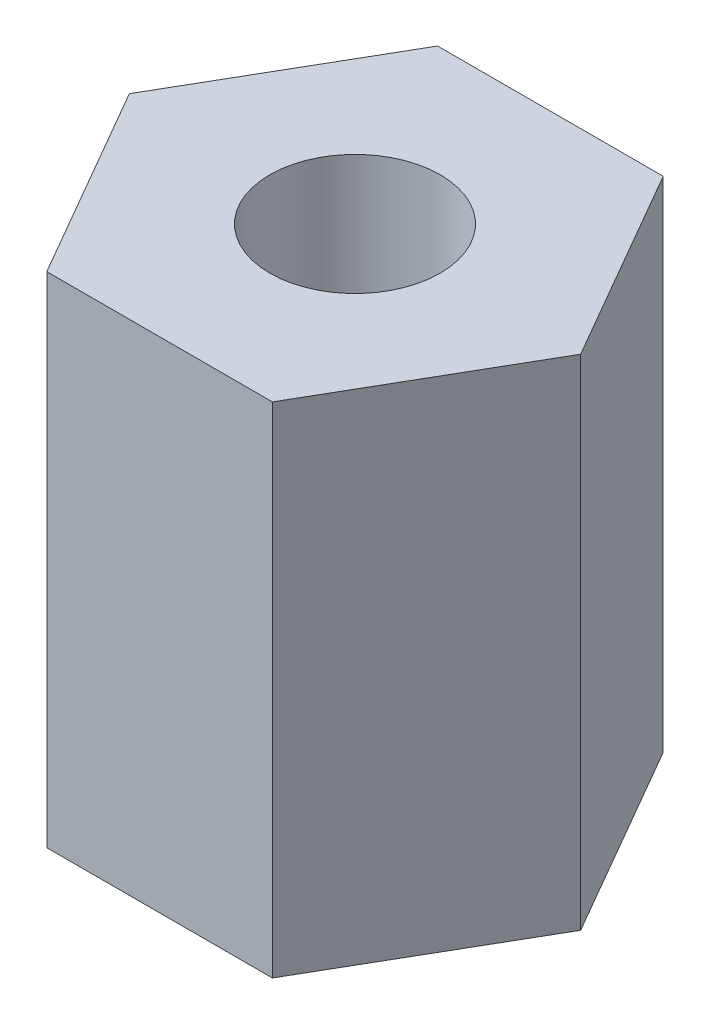
ISO-10303-21;
HEADER;
FILE_DESCRIPTION(('STEP AP214'),'2;1');
FILE_NAME('part.step','',(''),(''),'','','');
FILE_SCHEMA(('AUTOMOTIVE_DESIGN { 1 0 10303 214 1 1 1 1 }'));
ENDSEC;
DATA;
#1=APPLICATION_CONTEXT('core data for automotive mechanical design processes');
#2=APPLICATION_PROTOCOL_DEFINITION('international standard','automotive_design',2000,#1);
#3=PRODUCT_CONTEXT('',#1,'mechanical');
#4=PRODUCT('Part','Part','',(#3));
#5=PRODUCT_RELATED_PRODUCT_CATEGORY('part','',(#4));
#6=PRODUCT_DEFINITION_FORMATION('','',#4);
#7=PRODUCT_DEFINITION_CONTEXT('part definition',#1,'design');
#8=PRODUCT_DEFINITION('design','',#6,#7);
#9=PRODUCT_DEFINITION_SHAPE('','',#8);
#10=(LENGTH_UNIT() NAMED_UNIT(*) SI_UNIT(.MILLI.,.METRE.));
#11=(NAMED_UNIT(*) PLANE_ANGLE_UNIT() SI_UNIT($,.RADIAN.));
#12=(NAMED_UNIT(*) SI_UNIT($,.STERADIAN.) SOLID_ANGLE_UNIT());
#13=UNCERTAINTY_MEASURE_WITH_UNIT(LENGTH_MEASURE(1.E-05),#10,'distance_accuracy_value','');
#14=(GEOMETRIC_REPRESENTATION_CONTEXT(3) GLOBAL_UNCERTAINTY_ASSIGNED_CONTEXT((#13)) GLOBAL_UNIT_ASSIGNED_CONTEXT((#10,
#11,#12)) REPRESENTATION_CONTEXT('',''));
#15=CARTESIAN_POINT('',(0.,0.,0.));
#16=DIRECTION('',(0.,0.,1.));
#17=DIRECTION('',(1.,0.,0.));
#18=AXIS2_PLACEMENT_3D('',#15,#16,#17);
#19=CARTESIAN_POINT('',(-1.35677313259562,0.,2.35));
#20=DIRECTION('',(0.,0.,1.));
#21=DIRECTION('',(1.,0.,0.));
#22=AXIS2_PLACEMENT_3D('',#19,#20,#21);
#23=PLANE('',#22);
#24=DIRECTION('',(1.,0.,0.));
#25=VECTOR('',#24,1.);
#26=CARTESIAN_POINT('',(-1.35677313259562,6.,2.35));
#27=LINE('',#26,#25);
#28=CARTESIAN_POINT('',(-1.35677313259562,6.,2.35));
#29=VERTEX_POINT('',#28);
#30=CARTESIAN_POINT('',(1.35677313259562,6.,2.35));
#31=VERTEX_POINT('',#30);
#32=EDGE_CURVE('E118',#29,#31,#27,.T.);
#33=ORIENTED_EDGE('',*,*,#32,.F.);
#34=DIRECTION('',(0.,1.,0.));
#35=VECTOR('',#34,1.);
#36=CARTESIAN_POINT('',(-1.35677313259562,0.,2.35));
#37=LINE('',#36,#35);
#38=CARTESIAN_POINT('',(-1.35677313259562,0.,2.35));
#39=VERTEX_POINT('',#38);
#40=EDGE_CURVE('E11',#39,#29,#37,.T.);
#41=ORIENTED_EDGE('',*,*,#40,.F.);
#42=DIRECTION('',(1.,0.,0.));
#43=VECTOR('',#42,1.);
#44=CARTESIAN_POINT('',(-1.35677313259562,0.,2.35));
#45=LINE('',#44,#43);
#46=CARTESIAN_POINT('',(1.35677313259562,0.,2.35));
#47=VERTEX_POINT('',#46);
#48=EDGE_CURVE('E133',#39,#47,#45,.T.);
#49=ORIENTED_EDGE('',*,*,#48,.T.);
#50=DIRECTION('',(0.,1.,0.));
#51=VECTOR('',#50,1.);
#52=CARTESIAN_POINT('',(1.35677313259562,0.,2.35));
#53=LINE('',#52,#51);
#54=EDGE_CURVE('E36',#47,#31,#53,.T.);
#55=ORIENTED_EDGE('',*,*,#54,.T.);
#56=EDGE_LOOP('',(#33,#41,#49,#55));
#57=FACE_BOUND('',#56,.T.);
#58=ADVANCED_FACE('F33',(#57),#23,.T.);
#59=CARTESIAN_POINT('',(-2.71354626519124,0.,0.));
#60=DIRECTION('',(-0.866025403784439,0.,0.5));
#61=DIRECTION('',(0.5,0.,0.866025403784439));
#62=AXIS2_PLACEMENT_3D('',#59,#60,#61);
#63=PLANE('',#62);
#64=DIRECTION('',(0.5,0.,0.866025403784438));
#65=VECTOR('',#64,1.);
#66=CARTESIAN_POINT('',(-2.71354626519124,6.,0.));
#67=LINE('',#66,#65);
#68=CARTESIAN_POINT('',(-2.71354626519124,6.,0.));
#69=VERTEX_POINT('',#68);
#70=EDGE_CURVE('E131',#69,#29,#67,.T.);
#71=ORIENTED_EDGE('',*,*,#70,.F.);
#72=DIRECTION('',(0.,1.,0.));
#73=VECTOR('',#72,1.);
#74=CARTESIAN_POINT('',(-2.71354626519124,0.,0.));
#75=LINE('',#74,#73);
#76=CARTESIAN_POINT('',(-2.71354626519124,0.,0.));
#77=VERTEX_POINT('',#76);
#78=EDGE_CURVE('E42',#77,#69,#75,.T.);
#79=ORIENTED_EDGE('',*,*,#78,.F.);
#80=DIRECTION('',(0.5,0.,0.866025403784438));
#81=VECTOR('',#80,1.);
#82=CARTESIAN_POINT('',(-2.71354626519124,0.,0.));
#83=LINE('',#82,#81);
#84=EDGE_CURVE('E108',#77,#39,#83,.T.);
#85=ORIENTED_EDGE('',*,*,#84,.T.);
#86=ORIENTED_EDGE('',*,*,#40,.T.);
#87=EDGE_LOOP('',(#71,#79,#85,#86));
#88=FACE_BOUND('',#87,.T.);
#89=ADVANCED_FACE('F141',(#88),#63,.T.);
#90=CARTESIAN_POINT('',(-1.35677313259562,0.,-2.35));
#91=DIRECTION('',(-0.866025403784438,0.,-0.500000000000001));
#92=DIRECTION('',(-0.500000000000001,0.,0.866025403784438));
#93=AXIS2_PLACEMENT_3D('',#90,#91,#92);
#94=PLANE('',#93);
#95=DIRECTION('',(-0.5,0.,0.866025403784438));
#96=VECTOR('',#95,1.);
#97=CARTESIAN_POINT('',(-1.35677313259562,6.,-2.35));
#98=LINE('',#97,#96);
#99=CARTESIAN_POINT('',(-1.35677313259562,6.,-2.35));
#100=VERTEX_POINT('',#99);
#101=EDGE_CURVE('E95',#100,#69,#98,.T.);
#102=ORIENTED_EDGE('',*,*,#101,.F.);
#103=DIRECTION('',(0.,1.,0.));
#104=VECTOR('',#103,1.);
#105=CARTESIAN_POINT('',(-1.35677313259562,0.,-2.35));
#106=LINE('',#105,#104);
#107=CARTESIAN_POINT('',(-1.35677313259562,0.,-2.35));
#108=VERTEX_POINT('',#107);
#109=EDGE_CURVE('E90',#108,#100,#106,.T.);
#110=ORIENTED_EDGE('',*,*,#109,.F.);
#111=DIRECTION('',(-0.5,0.,0.866025403784438));
#112=VECTOR('',#111,1.);
#113=CARTESIAN_POINT('',(-1.35677313259562,0.,-2.35));
#114=LINE('',#113,#112);
#115=EDGE_CURVE('E93',#108,#77,#114,.T.);
#116=ORIENTED_EDGE('',*,*,#115,.T.);
#117=ORIENTED_EDGE('',*,*,#78,.T.);
#118=EDGE_LOOP('',(#102,#110,#116,#117));
#119=FACE_BOUND('',#118,.T.);
#120=ADVANCED_FACE('F92',(#119),#94,.T.);
#121=CARTESIAN_POINT('',(1.35677313259562,0.,-2.35));
#122=DIRECTION('',(0.,0.,-1.));
#123=DIRECTION('',(-1.,0.,0.));
#124=AXIS2_PLACEMENT_3D('',#121,#122,#123);
#125=PLANE('',#124);
#126=DIRECTION('',(-1.,0.,0.));
#127=VECTOR('',#126,1.);
#128=CARTESIAN_POINT('',(1.35677313259562,6.,-2.35));
#129=LINE('',#128,#127);
#130=CARTESIAN_POINT('',(1.35677313259562,6.,-2.35));
#131=VERTEX_POINT('',#130);
#132=EDGE_CURVE('E128',#131,#100,#129,.T.);
#133=ORIENTED_EDGE('',*,*,#132,.F.);
#134=DIRECTION('',(0.,1.,0.));
#135=VECTOR('',#134,1.);
#136=CARTESIAN_POINT('',(1.35677313259562,0.,-2.35));
#137=LINE('',#136,#135);
#138=CARTESIAN_POINT('',(1.35677313259562,0.,-2.35));
#139=VERTEX_POINT('',#138);
#140=EDGE_CURVE('E100',#139,#131,#137,.T.);
#141=ORIENTED_EDGE('',*,*,#140,.F.);
#142=DIRECTION('',(-1.,0.,0.));
#143=VECTOR('',#142,1.);
#144=CARTESIAN_POINT('',(1.35677313259562,0.,-2.35));
#145=LINE('',#144,#143);
#146=EDGE_CURVE('E106',#139,#108,#145,.T.);
#147=ORIENTED_EDGE('',*,*,#146,.T.);
#148=ORIENTED_EDGE('',*,*,#109,.T.);
#149=EDGE_LOOP('',(#133,#141,#147,#148));
#150=FACE_BOUND('',#149,.T.);
#151=ADVANCED_FACE('F110',(#150),#125,.T.);
#152=CARTESIAN_POINT('',(2.71354626519124,0.,0.));
#153=DIRECTION('',(0.866025403784439,0.,-0.5));
#154=DIRECTION('',(-0.5,0.,-0.866025403784439));
#155=AXIS2_PLACEMENT_3D('',#152,#153,#154);
#156=PLANE('',#155);
#157=DIRECTION('',(-0.5,0.,-0.866025403784438));
#158=VECTOR('',#157,1.);
#159=CARTESIAN_POINT('',(2.71354626519124,6.,0.));
#160=LINE('',#159,#158);
#161=CARTESIAN_POINT('',(2.71354626519124,6.,0.));
#162=VERTEX_POINT('',#161);
#163=EDGE_CURVE('E125',#162,#131,#160,.T.);
#164=ORIENTED_EDGE('',*,*,#163,.F.);
#165=DIRECTION('',(0.,1.,0.));
#166=VECTOR('',#165,1.);
#167=CARTESIAN_POINT('',(2.71354626519124,0.,0.));
#168=LINE('',#167,#166);
#169=CARTESIAN_POINT('',(2.71354626519124,0.,0.));
#170=VERTEX_POINT('',#169);
#171=EDGE_CURVE('E136',#170,#162,#168,.T.);
#172=ORIENTED_EDGE('',*,*,#171,.F.);
#173=DIRECTION('',(-0.5,0.,-0.866025403784438));
#174=VECTOR('',#173,1.);
#175=CARTESIAN_POINT('',(2.71354626519124,0.,0.));
#176=LINE('',#175,#174);
#177=EDGE_CURVE('E111',#170,#139,#176,.T.);
#178=ORIENTED_EDGE('',*,*,#177,.T.);
#179=ORIENTED_EDGE('',*,*,#140,.T.);
#180=EDGE_LOOP('',(#164,#172,#178,#179));
#181=FACE_BOUND('',#180,.T.);
#182=ADVANCED_FACE('F154',(#181),#156,.T.);
#183=CARTESIAN_POINT('',(1.35677313259562,0.,2.35));
#184=DIRECTION('',(0.866025403784438,0.,0.5));
#185=DIRECTION('',(0.5,0.,-0.866025403784438));
#186=AXIS2_PLACEMENT_3D('',#183,#184,#185);
#187=PLANE('',#186);
#188=DIRECTION('',(0.5,0.,-0.866025403784438));
#189=VECTOR('',#188,1.);
#190=CARTESIAN_POINT('',(1.35677313259562,6.,2.35));
#191=LINE('',#190,#189);
#192=EDGE_CURVE('E121',#31,#162,#191,.T.);
#193=ORIENTED_EDGE('',*,*,#192,.F.);
#194=ORIENTED_EDGE('',*,*,#54,.F.);
#195=DIRECTION('',(0.5,0.,-0.866025403784438));
#196=VECTOR('',#195,1.);
#197=CARTESIAN_POINT('',(1.35677313259562,0.,2.35));
#198=LINE('',#197,#196);
#199=EDGE_CURVE('E113',#47,#170,#198,.T.);
#200=ORIENTED_EDGE('',*,*,#199,.T.);
#201=ORIENTED_EDGE('',*,*,#171,.T.);
#202=EDGE_LOOP('',(#193,#194,#200,#201));
#203=FACE_BOUND('',#202,.T.);
#204=ADVANCED_FACE('F138',(#203),#187,.T.);
#205=CARTESIAN_POINT('',(0.,0.,0.));
#206=DIRECTION('',(0.,1.,0.));
#207=DIRECTION('',(0.,0.,1.));
#208=AXIS2_PLACEMENT_3D('',#205,#206,#207);
#209=PLANE('',#208);
#210=CARTESIAN_POINT('',(0.,0.,0.));
#211=DIRECTION('',(0.,1.,0.));
#212=DIRECTION('',(0.,0.,1.));
#213=AXIS2_PLACEMENT_3D('',#210,#211,#212);
#214=CIRCLE('',#213,1.025);
#215=CARTESIAN_POINT('',(0.,0.,1.025));
#216=VERTEX_POINT('',#215);
#217=EDGE_CURVE('E122',#216,#216,#214,.T.);
#218=ORIENTED_EDGE('',*,*,#217,.T.);
#219=EDGE_LOOP('',(#218));
#220=FACE_BOUND('',#219,.T.);
#221=ORIENTED_EDGE('',*,*,#48,.F.);
#222=ORIENTED_EDGE('',*,*,#84,.F.);
#223=ORIENTED_EDGE('',*,*,#115,.F.);
#224=ORIENTED_EDGE('',*,*,#146,.F.);
#225=ORIENTED_EDGE('',*,*,#177,.F.);
#226=ORIENTED_EDGE('',*,*,#199,.F.);
#227=EDGE_LOOP('',(#221,#222,#223,#224,#225,#226));
#228=FACE_BOUND('',#227,.T.);
#229=ADVANCED_FACE('F104',(#220,#228),#209,.F.);
#230=CARTESIAN_POINT('',(0.,6.,0.));
#231=DIRECTION('',(0.,1.,0.));
#232=DIRECTION('',(0.,0.,1.));
#233=AXIS2_PLACEMENT_3D('',#230,#231,#232);
#234=PLANE('',#233);
#235=CARTESIAN_POINT('',(0.,6.,0.));
#236=DIRECTION('',(0.,1.,0.));
#237=DIRECTION('',(0.,0.,1.));
#238=AXIS2_PLACEMENT_3D('',#235,#236,#237);
#239=CIRCLE('',#238,1.025);
#240=CARTESIAN_POINT('',(0.,6.,1.025));
#241=VERTEX_POINT('',#240);
#242=EDGE_CURVE('E176',#241,#241,#239,.T.);
#243=ORIENTED_EDGE('',*,*,#242,.F.);
#244=EDGE_LOOP('',(#243));
#245=FACE_BOUND('',#244,.T.);
#246=ORIENTED_EDGE('',*,*,#32,.T.);
#247=ORIENTED_EDGE('',*,*,#192,.T.);
#248=ORIENTED_EDGE('',*,*,#163,.T.);
#249=ORIENTED_EDGE('',*,*,#132,.T.);
#250=ORIENTED_EDGE('',*,*,#101,.T.);
#251=ORIENTED_EDGE('',*,*,#70,.T.);
#252=EDGE_LOOP('',(#246,#247,#248,#249,#250,#251));
#253=FACE_BOUND('',#252,.T.);
#254=ADVANCED_FACE('F140',(#245,#253),#234,.T.);
#255=CARTESIAN_POINT('',(0.,6.,0.));
#256=DIRECTION('',(0.,1.,0.));
#257=DIRECTION('',(0.,0.,1.));
#258=AXIS2_PLACEMENT_3D('',#255,#256,#257);
#259=CYLINDRICAL_SURFACE('',#258,1.025);
#260=ORIENTED_EDGE('',*,*,#242,.T.);
#261=EDGE_LOOP('',(#260));
#262=FACE_BOUND('',#261,.T.);
#263=ORIENTED_EDGE('',*,*,#217,.F.);
#264=EDGE_LOOP('',(#263));
#265=FACE_BOUND('',#264,.T.);
#266=ADVANCED_FACE('F165',(#262,#265),#259,.F.);
#267=CLOSED_SHELL('',(#58,#89,#120,#151,#182,#204,#229,#254,#266));
#268=MANIFOLD_SOLID_BREP('B2',#267);
#269=ADVANCED_BREP_SHAPE_REPRESENTATION('',(#18,#268),#14);
#270=SHAPE_DEFINITION_REPRESENTATION(#9,#269);
ENDSEC;
END-ISO-10303-21;
